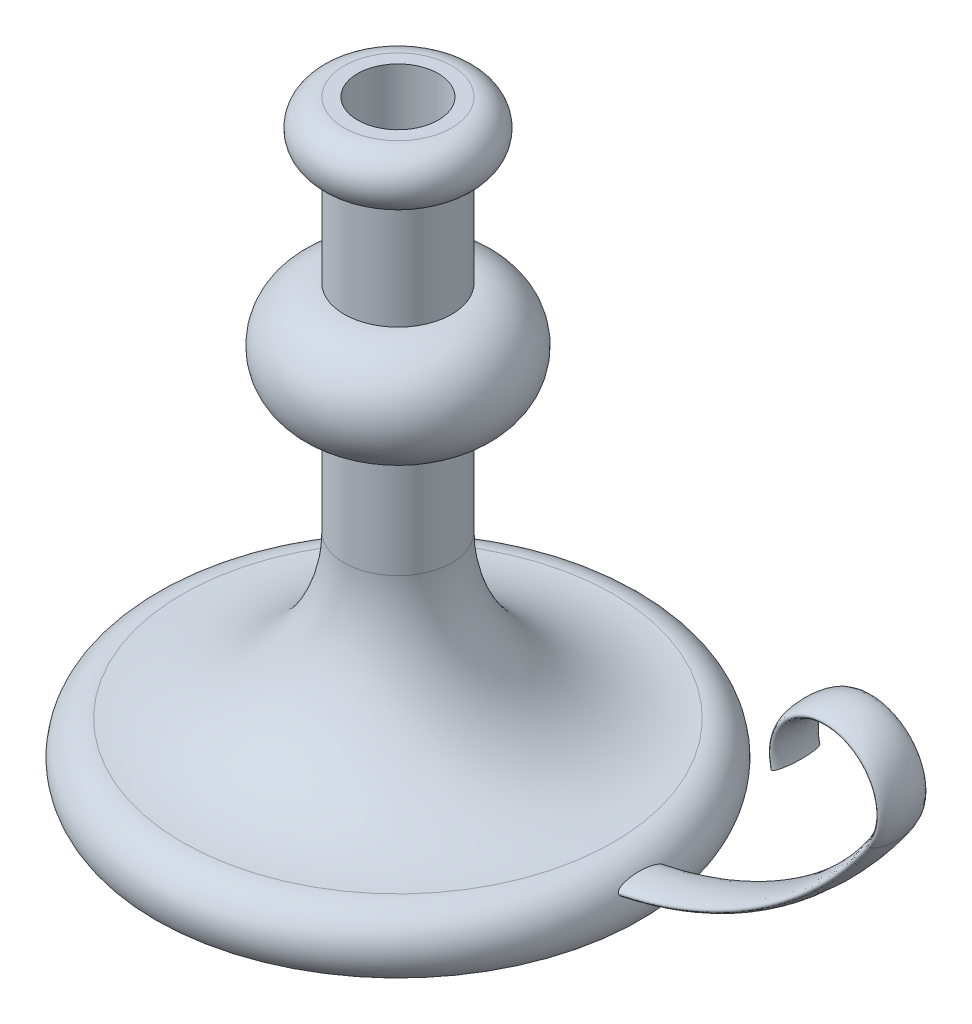
ISO-10303-21;
HEADER;
FILE_DESCRIPTION(('STEP AP214'),'2;1');
FILE_NAME('part.step','',(''),(''),'','','');
FILE_SCHEMA(('AUTOMOTIVE_DESIGN { 1 0 10303 214 1 1 1 1 }'));
ENDSEC;
DATA;
#1=APPLICATION_CONTEXT('core data for automotive mechanical design processes');
#2=APPLICATION_PROTOCOL_DEFINITION('international standard','automotive_design',2000,#1);
#3=PRODUCT_CONTEXT('',#1,'mechanical');
#4=PRODUCT('Part','Part','',(#3));
#5=PRODUCT_RELATED_PRODUCT_CATEGORY('part','',(#4));
#6=PRODUCT_DEFINITION_FORMATION('','',#4);
#7=PRODUCT_DEFINITION_CONTEXT('part definition',#1,'design');
#8=PRODUCT_DEFINITION('design','',#6,#7);
#9=PRODUCT_DEFINITION_SHAPE('','',#8);
#10=(LENGTH_UNIT() NAMED_UNIT(*) SI_UNIT(.MILLI.,.METRE.));
#11=(NAMED_UNIT(*) PLANE_ANGLE_UNIT() SI_UNIT($,.RADIAN.));
#12=(NAMED_UNIT(*) SI_UNIT($,.STERADIAN.) SOLID_ANGLE_UNIT());
#13=UNCERTAINTY_MEASURE_WITH_UNIT(LENGTH_MEASURE(1.E-05),#10,'distance_accuracy_value','');
#14=(GEOMETRIC_REPRESENTATION_CONTEXT(3) GLOBAL_UNCERTAINTY_ASSIGNED_CONTEXT((#13)) GLOBAL_UNIT_ASSIGNED_CONTEXT((#10,
#11,#12)) REPRESENTATION_CONTEXT('',''));
#15=CARTESIAN_POINT('',(0.,0.,0.));
#16=DIRECTION('',(0.,0.,1.));
#17=DIRECTION('',(1.,0.,0.));
#18=AXIS2_PLACEMENT_3D('',#15,#16,#17);
#19=CARTESIAN_POINT('',(0.,190.5,0.));
#20=DIRECTION('',(0.,-1.,0.));
#21=DIRECTION('',(0.,0.,-1.));
#22=AXIS2_PLACEMENT_3D('',#19,#20,#21);
#23=TOROIDAL_SURFACE('',#22,2032.,317.5);
#24=CARTESIAN_POINT('',(2304.1559666721,334.729740597242,-222.25));
#25=CARTESIAN_POINT('',(2303.97400076728,335.084946485986,-222.250000317295));
#26=CARTESIAN_POINT('',(2303.79230153902,335.440285609509,-222.237734709247));
#27=CARTESIAN_POINT('',(2303.4300532062,336.149998636067,-222.188810760381));
#28=CARTESIAN_POINT('',(2303.24950445655,336.504372223619,-222.152145228526));
#29=CARTESIAN_POINT('',(2302.89025183536,337.210751589177,-222.054894841088));
#30=CARTESIAN_POINT('',(2302.71154795634,337.562757376769,-221.994310082416));
#31=CARTESIAN_POINT('',(2302.35634513512,338.26364002046,-221.849914702679));
#32=CARTESIAN_POINT('',(2302.17984913808,338.61251255169,-221.766075930914));
#33=CARTESIAN_POINT('',(2301.8297837212,339.305642684299,-221.576236389163));
#34=CARTESIAN_POINT('',(2301.65621427386,339.649900329024,-221.470235827497));
#35=CARTESIAN_POINT('',(2301.3123953702,340.332949086654,-221.237279933162));
#36=CARTESIAN_POINT('',(2301.14214612569,340.671739850553,-221.110323268416));
#37=CARTESIAN_POINT('',(2300.81313461308,341.32750145886,-220.843160904167));
#38=CARTESIAN_POINT('',(2300.65420662243,341.644753709765,-220.703847524678));
#39=CARTESIAN_POINT('',(2300.33984097271,342.273209002574,-220.408581956684));
#40=CARTESIAN_POINT('',(2300.18440380434,342.584411193221,-220.252627446481));
#41=CARTESIAN_POINT('',(2299.72349975676,343.508495435025,-219.761572973886));
#42=CARTESIAN_POINT('',(2299.42343346316,344.111868858729,-219.403276397344));
#43=CARTESIAN_POINT('',(2298.83772865829,345.292658530768,-218.633669522771));
#44=CARTESIAN_POINT('',(2298.55211848609,345.870023567099,-218.222260313007));
#45=CARTESIAN_POINT('',(2297.99554808247,346.997841011149,-217.355269785157));
#46=CARTESIAN_POINT('',(2297.7245878543,347.548293412915,-216.899688457299));
#47=CARTESIAN_POINT('',(2297.15681673526,348.704272421776,-215.880001450807));
#48=CARTESIAN_POINT('',(2296.86226708659,349.305591120131,-215.309889329515));
#49=CARTESIAN_POINT('',(2296.29012981291,350.476311941716,-214.129220534062));
#50=CARTESIAN_POINT('',(2296.01255337329,351.045692997965,-213.518637730283));
#51=CARTESIAN_POINT('',(2295.47303667554,352.154729955203,-212.26426966855));
#52=CARTESIAN_POINT('',(2295.21110084615,352.694377433642,-211.620475101771));
#53=CARTESIAN_POINT('',(2294.70106197366,353.747214097881,-210.304232540721));
#54=CARTESIAN_POINT('',(2294.45298626695,354.2603508562,-209.631732237341));
#55=CARTESIAN_POINT('',(2293.96999096714,355.261191149071,-208.263986895508));
#56=CARTESIAN_POINT('',(2293.73506639035,355.748904313172,-207.568750633401));
#57=CARTESIAN_POINT('',(2293.27710311745,356.701207702042,-206.158909352676));
#58=CARTESIAN_POINT('',(2293.05406389626,357.16579894826,-205.444305191826));
#59=CARTESIAN_POINT('',(2292.58983838913,358.134230778406,-203.902367277724));
#60=CARTESIAN_POINT('',(2292.3501873304,358.635066312773,-203.0726875968));
#61=CARTESIAN_POINT('',(2291.8834166012,359.612048516542,-201.395429262424));
#62=CARTESIAN_POINT('',(2291.6562978838,360.088193308071,-200.547849254429));
#63=CARTESIAN_POINT('',(2291.21343639336,361.017932700857,-198.837481080693));
#64=CARTESIAN_POINT('',(2290.99769399652,361.471526556355,-197.974692413279));
#65=CARTESIAN_POINT('',(2290.57695752212,362.357242850115,-196.237640079103));
#66=CARTESIAN_POINT('',(2290.37194492899,362.789402203898,-195.363399669401));
#67=CARTESIAN_POINT('',(2289.9713930014,363.634729487632,-193.603741802654));
#68=CARTESIAN_POINT('',(2289.77585297067,364.047898813311,-192.718325173154));
#69=CARTESIAN_POINT('',(2289.39347129017,364.856710589385,-190.937707846759));
#70=CARTESIAN_POINT('',(2289.20662943581,365.252353452009,-190.042507380601));
#71=CARTESIAN_POINT('',(2288.80313401204,366.107586857478,-188.057359230284));
#72=CARTESIAN_POINT('',(2288.58831143304,366.563470009665,-186.965442627711));
#73=CARTESIAN_POINT('',(2288.16931803474,367.453547556042,-184.770747504202));
#74=CARTESIAN_POINT('',(2287.96514769018,367.887740983511,-183.667968501743));
#75=CARTESIAN_POINT('',(2287.56648057395,368.736334786809,-181.452397256692));
#76=CARTESIAN_POINT('',(2287.37198908698,369.150724344853,-180.339599927248));
#77=CARTESIAN_POINT('',(2286.99203640899,369.960925751935,-178.105760766363));
#78=CARTESIAN_POINT('',(2286.80657510066,370.356737842323,-176.984719042249));
#79=CARTESIAN_POINT('',(2286.44385925864,371.131409795074,-174.734386254785));
#80=CARTESIAN_POINT('',(2286.26661187453,371.510254879677,-173.605088959823));
#81=CARTESIAN_POINT('',(2285.91990814355,372.251770040455,-171.340011009868));
#82=CARTESIAN_POINT('',(2285.75045182053,372.614440067101,-170.204230335035));
#83=CARTESIAN_POINT('',(2285.41872363538,373.324807338501,-167.926255360748));
#84=CARTESIAN_POINT('',(2285.25645578989,373.672496209473,-166.784057867621));
#85=CARTESIAN_POINT('',(2284.93874929332,374.353581513749,-164.494457929216));
#86=CARTESIAN_POINT('',(2284.78331073477,374.686977753386,-163.347055413643));
#87=CARTESIAN_POINT('',(2284.32664815517,375.666886621238,-159.898047837324));
#88=CARTESIAN_POINT('',(2284.03504224907,376.293194338468,-157.5894010691));
#89=CARTESIAN_POINT('',(2283.47279425699,377.501546525883,-152.940656207002));
#90=CARTESIAN_POINT('',(2283.20231269835,378.083251540051,-150.600451060843));
#91=CARTESIAN_POINT('',(2282.68251792862,379.20164492048,-145.908690168767));
#92=CARTESIAN_POINT('',(2282.43319050368,379.738363510977,-143.557143184577));
#93=CARTESIAN_POINT('',(2281.95375800258,380.770734080844,-138.844071914548));
#94=CARTESIAN_POINT('',(2281.72364568993,381.266401519678,-136.482551739879));
#95=CARTESIAN_POINT('',(2281.28106671776,382.219896385412,-131.750705134173));
#96=CARTESIAN_POINT('',(2281.06859686085,382.677730668829,-129.380380380519));
#97=CARTESIAN_POINT('',(2280.66001129479,383.55822461802,-124.631965126681));
#98=CARTESIAN_POINT('',(2280.46389464243,383.980886312436,-122.253875082607));
#99=CARTESIAN_POINT('',(2280.0340284667,384.907304769588,-116.822339876186));
#100=CARTESIAN_POINT('',(2279.80516894405,385.400520134522,-113.766707528854));
#101=CARTESIAN_POINT('',(2279.37066167417,386.336815807819,-107.646071965312));
#102=CARTESIAN_POINT('',(2279.16501459503,386.779894673193,-104.581068481995));
#103=CARTESIAN_POINT('',(2278.77536155996,387.619263421602,-98.441873803468));
#104=CARTESIAN_POINT('',(2278.59136552592,388.015531853403,-95.3676790528279));
#105=CARTESIAN_POINT('',(2278.24390369052,388.76367208211,-89.2127758478801));
#106=CARTESIAN_POINT('',(2278.08043771789,389.115544249356,-86.1320674481251));
#107=CARTESIAN_POINT('',(2277.7729162855,389.777327917136,-79.9628219626307));
#108=CARTESIAN_POINT('',(2277.62887564037,390.087207393002,-76.8742807115996));
#109=CARTESIAN_POINT('',(2277.35952720715,390.666504668936,-70.6925931302701));
#110=CARTESIAN_POINT('',(2277.23421945693,390.9359223872,-67.599446790674));
#111=CARTESIAN_POINT('',(2277.00157845047,391.435976365978,-61.4070664060374));
#112=CARTESIAN_POINT('',(2276.8942584433,391.666584041026,-58.3078295600716));
#113=CARTESIAN_POINT('',(2276.69715726784,392.090006106433,-52.106225794538));
#114=CARTESIAN_POINT('',(2276.60737608792,392.282820521872,-49.0038588770487));
#115=CARTESIAN_POINT('',(2276.4448705928,392.631741524039,-42.7949234423548));
#116=CARTESIAN_POINT('',(2276.37215559279,392.787828063796,-39.6883535571163));
#117=CARTESIAN_POINT('',(2276.24350355535,393.063937000793,-33.4732672064837));
#118=CARTESIAN_POINT('',(2276.18756652007,393.183959393437,-30.3647507408417));
#119=CARTESIAN_POINT('',(2276.09220238517,393.388552398515,-24.1454609420847));
#120=CARTESIAN_POINT('',(2276.05277974299,393.473113439479,-21.0346872263773));
#121=CARTESIAN_POINT('',(2275.99029016753,393.607142117669,-14.8122213819607));
#122=CARTESIAN_POINT('',(2275.96722323287,393.656609757837,-11.7005292533285));
#123=CARTESIAN_POINT('',(2275.93735959765,393.720651572324,-5.48004533104016));
#124=CARTESIAN_POINT('',(2275.93054547923,393.735263101327,-2.37125400475369));
#125=CARTESIAN_POINT('',(2275.93310691828,393.729770421141,3.84629144246669));
#126=CARTESIAN_POINT('',(2275.94248247597,393.709666211463,6.95504556340008));
#127=CARTESIAN_POINT('',(2275.97745571493,393.634665642279,13.1705399775705));
#128=CARTESIAN_POINT('',(2276.00304554919,393.579786112528,16.2772805176657));
#129=CARTESIAN_POINT('',(2276.07055255304,393.434990938745,22.489768937834));
#130=CARTESIAN_POINT('',(2276.11246972117,393.345075297852,25.595516817996));
#131=CARTESIAN_POINT('',(2276.21278998992,393.129838651622,31.8037541156748));
#132=CARTESIAN_POINT('',(2276.27118370896,393.00453779426,34.9062443819433));
#133=CARTESIAN_POINT('',(2276.40473334567,392.71789954569,41.1092034517779));
#134=CARTESIAN_POINT('',(2276.47988927004,392.556562140081,44.2096722545356));
#135=CARTESIAN_POINT('',(2276.64726605635,392.197155060524,50.4061265801329));
#136=CARTESIAN_POINT('',(2276.73947649179,391.999107829461,53.5021136836353));
#137=CARTESIAN_POINT('',(2276.94144294481,391.565198280324,59.6908658574333));
#138=CARTESIAN_POINT('',(2277.0511989401,391.329336010303,62.7836309318182));
#139=CARTESIAN_POINT('',(2277.28875339143,390.818676677525,68.9635490001485));
#140=CARTESIAN_POINT('',(2277.41654192283,390.543901031402,72.050704141285));
#141=CARTESIAN_POINT('',(2277.69089771033,389.953783309454,78.2203247330437));
#142=CARTESIAN_POINT('',(2277.8374650633,389.63844102435,81.3027901593893));
#143=CARTESIAN_POINT('',(2278.150177791,388.965430808754,87.4612452943413));
#144=CARTESIAN_POINT('',(2278.31631771633,388.607774659144,90.5372365638493));
#145=CARTESIAN_POINT('',(2278.66923126701,387.847841581022,96.6824756573887));
#146=CARTESIAN_POINT('',(2278.85600452043,387.445565456806,99.7517236019551));
#147=CARTESIAN_POINT('',(2279.24946338851,386.597951443085,105.85162958658));
#148=CARTESIAN_POINT('',(2279.45593144946,386.153083864504,108.882366838902));
#149=CARTESIAN_POINT('',(2279.89181679753,385.213790830797,114.934712427944));
#150=CARTESIAN_POINT('',(2280.1212354629,384.719362399363,117.956320205167));
#151=CARTESIAN_POINT('',(2280.60487085901,383.677063362956,123.988806552023));
#152=CARTESIAN_POINT('',(2280.85909131631,383.129184726858,126.999683438627));
#153=CARTESIAN_POINT('',(2281.39464811048,381.975168752824,133.008979604929));
#154=CARTESIAN_POINT('',(2281.67599359991,381.369011750735,136.007394321141));
#155=CARTESIAN_POINT('',(2282.11978460859,380.413212518826,140.486060671493));
#156=CARTESIAN_POINT('',(2282.27099244288,380.087608277424,141.972587021171));
#157=CARTESIAN_POINT('',(2282.58124293405,379.419687153534,144.941054863001));
#158=CARTESIAN_POINT('',(2282.74028550713,379.077370449832,146.422996404019));
#159=CARTESIAN_POINT('',(2283.06666996238,378.375086596019,149.381717942555));
#160=CARTESIAN_POINT('',(2283.23401152766,378.01512011988,150.858498134861));
#161=CARTESIAN_POINT('',(2283.57753671605,377.276445932768,153.806335435514));
#162=CARTESIAN_POINT('',(2283.75372031754,376.897738267597,155.27739255784));
#163=CARTESIAN_POINT('',(2284.11546421764,376.120526012246,158.212429648398));
#164=CARTESIAN_POINT('',(2284.30102043833,375.722030032952,159.676412395948));
#165=CARTESIAN_POINT('',(2284.68228353137,374.903692727569,162.597100064386));
#166=CARTESIAN_POINT('',(2284.87799050869,374.483851180733,164.053804909839));
#167=CARTESIAN_POINT('',(2285.28028319435,373.621399957182,166.958314947362));
#168=CARTESIAN_POINT('',(2285.4868645248,373.178799444593,168.406123462772));
#169=CARTESIAN_POINT('',(2285.91191056359,372.268846577765,171.292155891668));
#170=CARTESIAN_POINT('',(2286.13037484511,371.801495112541,172.730380147319));
#171=CARTESIAN_POINT('',(2286.50501457793,371.000775681001,175.116324286067));
#172=CARTESIAN_POINT('',(2286.65757076113,370.674905441508,176.067133534953));
#173=CARTESIAN_POINT('',(2286.96880891227,370.010523829288,177.963313973002));
#174=CARTESIAN_POINT('',(2287.12749081295,369.67201259535,178.908685221737));
#175=CARTESIAN_POINT('',(2287.45139818166,368.981540942848,180.793390187422));
#176=CARTESIAN_POINT('',(2287.6166237008,368.629580419265,181.73272385716));
#177=CARTESIAN_POINT('',(2287.95439970257,367.910642348534,183.606371500972));
#178=CARTESIAN_POINT('',(2288.12696324613,367.543638070813,184.540672878412));
#179=CARTESIAN_POINT('',(2288.47965952226,366.794207225628,186.401646269481));
#180=CARTESIAN_POINT('',(2288.65979228484,366.411780597011,187.328318252841));
#181=CARTESIAN_POINT('',(2289.02822982768,365.630354881972,189.173022885806));
#182=CARTESIAN_POINT('',(2289.21653465179,365.231355706609,190.091055489013));
#183=CARTESIAN_POINT('',(2289.6448478025,364.324795037924,192.120291348987));
#184=CARTESIAN_POINT('',(2289.8870442259,363.812817766327,193.229069236913));
#185=CARTESIAN_POINT('',(2290.38613746172,362.759382337593,195.429329529611));
#186=CARTESIAN_POINT('',(2290.64303537408,362.217921974719,196.520810632441));
#187=CARTESIAN_POINT('',(2291.1733321821,361.102125334291,198.683324808603));
#188=CARTESIAN_POINT('',(2291.44673688944,360.527777481476,199.754350503261));
#189=CARTESIAN_POINT('',(2292.01145365966,359.343740251149,201.869001725569));
#190=CARTESIAN_POINT('',(2292.30272795575,358.734125554651,202.912678810961));
#191=CARTESIAN_POINT('',(2292.75521538111,357.789156034455,204.45468975405));
#192=CARTESIAN_POINT('',(2292.90862632864,357.469104468827,204.964732086247));
#193=CARTESIAN_POINT('',(2293.22100529682,356.818148280874,205.97610337213));
#194=CARTESIAN_POINT('',(2293.37997308209,356.487244118297,206.477432693552));
#195=CARTESIAN_POINT('',(2293.70375748671,355.814074595704,207.470071690455));
#196=CARTESIAN_POINT('',(2293.86857087751,355.471815513591,207.961386667846));
#197=CARTESIAN_POINT('',(2294.20452835707,354.775046945159,208.933014798618));
#198=CARTESIAN_POINT('',(2294.3756721977,354.420537939022,209.413328382016));
#199=CARTESIAN_POINT('',(2294.79668411037,353.549641219511,210.556994354342));
#200=CARTESIAN_POINT('',(2295.04992672585,353.026754487979,211.214196968444));
#201=CARTESIAN_POINT('',(2295.57127045709,351.952589661247,212.498969975302));
#202=CARTESIAN_POINT('',(2295.83937182725,351.401311079925,213.126539860335));
#203=CARTESIAN_POINT('',(2296.39189106745,350.267848588138,214.34590821425));
#204=CARTESIAN_POINT('',(2296.67631114083,349.685660505078,214.937701830372));
#205=CARTESIAN_POINT('',(2297.26282605357,348.488168820093,216.077536841372));
#206=CARTESIAN_POINT('',(2297.5649181129,347.872870428056,216.625585086053));
#207=CARTESIAN_POINT('',(2298.13553440219,346.713893172404,217.580359449584));
#208=CARTESIAN_POINT('',(2298.40114558342,346.175600518545,217.995343005445));
#209=CARTESIAN_POINT('',(2298.94594089987,345.074260807971,218.781573978856));
#210=CARTESIAN_POINT('',(2299.22512533524,344.511213203884,219.152820428639));
#211=CARTESIAN_POINT('',(2299.7966150989,343.361741711216,219.843235882668));
#212=CARTESIAN_POINT('',(2300.08889722847,342.77535934476,220.162492657514));
#213=CARTESIAN_POINT('',(2300.68639283373,341.580076205633,220.741249997513));
#214=CARTESIAN_POINT('',(2300.99160218381,340.971182625,221.000769459715));
#215=CARTESIAN_POINT('',(2301.5447135309,339.871063896606,221.401907713103));
#216=CARTESIAN_POINT('',(2301.79037180685,339.383576736963,221.556907441218));
#217=CARTESIAN_POINT('',(2302.28751535715,338.399449788857,221.822118517773));
#218=CARTESIAN_POINT('',(2302.53899989802,337.902811154077,221.932335471921));
#219=CARTESIAN_POINT('',(2303.04614851452,336.903807265541,222.105154374164));
#220=CARTESIAN_POINT('',(2303.3018096622,336.401446092449,222.167788329899));
#221=CARTESIAN_POINT('',(2303.81570138599,335.394282758894,222.243911547522));
#222=CARTESIAN_POINT('',(2304.0739320109,334.889480552161,222.257399874152));
#223=CARTESIAN_POINT('',(2304.59116809822,333.881012829238,222.234916971281));
#224=CARTESIAN_POINT('',(2304.85017392609,333.377348152779,222.198916745714));
#225=CARTESIAN_POINT('',(2305.36687811629,332.375214776092,222.078504889112));
#226=CARTESIAN_POINT('',(2305.62457649501,331.876746010611,221.994093866792));
#227=CARTESIAN_POINT('',(2306.13710927714,330.887962633609,221.779111932763));
#228=CARTESIAN_POINT('',(2306.39194154834,330.397653977429,221.648508733927));
#229=CARTESIAN_POINT('',(2306.89712957165,329.428192071975,221.344406458596));
#230=CARTESIAN_POINT('',(2307.14748472163,328.949040320587,221.170901658198));
#231=CARTESIAN_POINT('',(2307.73051507625,327.836065538908,220.716201464492));
#232=CARTESIAN_POINT('',(2308.06087584194,327.207694129342,220.41863975268));
#233=CARTESIAN_POINT('',(2308.70966572514,325.977826055669,219.761524789015));
#234=CARTESIAN_POINT('',(2309.02809030519,325.376339595315,219.4019482478));
#235=CARTESIAN_POINT('',(2309.6528603122,324.200051842096,218.629494370956));
#236=CARTESIAN_POINT('',(2309.9591788037,323.625309599838,218.216506052761));
#237=CARTESIAN_POINT('',(2310.55894292796,322.503544755947,217.346265533012));
#238=CARTESIAN_POINT('',(2310.85238876539,321.956521713559,216.88901403561));
#239=CARTESIAN_POINT('',(2311.47369678749,320.80185371454,215.859685735381));
#240=CARTESIAN_POINT('',(2311.79935718106,320.198890247036,215.281049578088));
#241=CARTESIAN_POINT('',(2312.43493094797,319.026099440702,214.082404685798));
#242=CARTESIAN_POINT('',(2312.74483365858,318.456294502512,213.462368576131));
#243=CARTESIAN_POINT('',(2313.34989865447,317.347390508939,212.188358628695));
#244=CARTESIAN_POINT('',(2313.64505666264,316.808300356939,211.534375054412));
#245=CARTESIAN_POINT('',(2314.22224481041,315.757368261468,210.197130710167));
#246=CARTESIAN_POINT('',(2314.50424864128,315.245580653028,209.513816110381));
#247=CARTESIAN_POINT('',(2315.05552631118,314.248089259701,208.123949700319));
#248=CARTESIAN_POINT('',(2315.32480505968,313.762375405287,207.417407033054));
#249=CARTESIAN_POINT('',(2315.85175626195,312.814599894487,205.984524171191));
#250=CARTESIAN_POINT('',(2316.10942924997,312.352537149186,205.258184890407));
#251=CARTESIAN_POINT('',(2316.64818521822,311.389085485827,203.689384579682));
#252=CARTESIAN_POINT('',(2316.92773121574,310.890810925477,202.844486798383));
#253=CARTESIAN_POINT('',(2317.47429829023,309.919483205357,201.136307053958));
#254=CARTESIAN_POINT('',(2317.74131837984,309.446432033442,200.273023649344));
#255=CARTESIAN_POINT('',(2318.26387073472,308.523320088651,198.53082445298));
#256=CARTESIAN_POINT('',(2318.51940261741,308.073260081358,197.651908141982));
#257=CARTESIAN_POINT('',(2319.01942523523,307.194995746726,195.882303436447));
#258=CARTESIAN_POINT('',(2319.26393546256,306.766752645432,194.991639740054));
#259=CARTESIAN_POINT('',(2319.74319766635,305.929560163314,193.198799293259));
#260=CARTESIAN_POINT('',(2319.97795035951,305.520609365159,192.296623394818));
#261=CARTESIAN_POINT('',(2320.43841179741,304.720487966243,190.482179384812));
#262=CARTESIAN_POINT('',(2320.66412073421,304.329316987848,189.569911488106));
#263=CARTESIAN_POINT('',(2321.15298097529,303.484143616711,187.546677093603));
#264=CARTESIAN_POINT('',(2321.41420941684,303.033900000228,186.433676242449));
#265=CARTESIAN_POINT('',(2321.92535974959,302.155361528522,184.196438992824));
#266=CARTESIAN_POINT('',(2322.17528113643,301.727067652266,183.072202095889));
#267=CARTESIAN_POINT('',(2322.66475906761,300.890487289843,180.813356521097));
#268=CARTESIAN_POINT('',(2322.90430987934,300.48221185326,179.678742516354));
#269=CARTESIAN_POINT('',(2323.37361293817,299.684414519587,177.400957334864));
#270=CARTESIAN_POINT('',(2323.60336531256,299.294892378846,176.257786269518));
#271=CARTESIAN_POINT('',(2324.05389266912,298.5329500473,173.962886342094));
#272=CARTESIAN_POINT('',(2324.27465980593,298.160544766677,172.811150997574));
#273=CARTESIAN_POINT('',(2324.70755997929,297.432027698844,170.500928778975));
#274=CARTESIAN_POINT('',(2324.91969298935,297.075915961612,169.342441884201));
#275=CARTESIAN_POINT('',(2325.33592654932,296.378765970446,167.018794839453));
#276=CARTESIAN_POINT('',(2325.54002261841,296.037736112396,165.853631370419));
#277=CARTESIAN_POINT('',(2325.94049113434,295.370046649272,163.517866440232));
#278=CARTESIAN_POINT('',(2326.13686347513,295.043387241533,162.347264904646));
#279=CARTESIAN_POINT('',(2326.71494700723,294.083782075721,158.828346540062));
#280=CARTESIAN_POINT('',(2327.08567028129,293.471133122043,156.472660305166));
#281=CARTESIAN_POINT('',(2327.80304400369,292.290127590461,151.727898694317));
#282=CARTESIAN_POINT('',(2328.14949787996,291.722128953177,149.338705152247));
#283=CARTESIAN_POINT('',(2328.81726270784,290.631239012606,144.548308158187));
#284=CARTESIAN_POINT('',(2329.13859054616,290.108317389318,142.147113946614));
#285=CARTESIAN_POINT('',(2329.75802723384,289.103571552426,137.334139671382));
#286=CARTESIAN_POINT('',(2330.05614469428,288.621732090921,134.922363887682));
#287=CARTESIAN_POINT('',(2330.63072210752,287.695879644081,130.089443421394));
#288=CARTESIAN_POINT('',(2330.90718574789,287.251860216984,127.668300408033));
#289=CARTESIAN_POINT('',(2331.43973724075,286.39894846951,122.817727789035));
#290=CARTESIAN_POINT('',(2331.6958259481,285.990054675303,120.388298535531));
#291=CARTESIAN_POINT('',(2332.24337299293,285.118055630006,114.982317639592));
#292=CARTESIAN_POINT('',(2332.53007128155,284.663052777181,112.003975966098));
#293=CARTESIAN_POINT('',(2333.07624055539,283.798708181418,106.038133611618));
#294=CARTESIAN_POINT('',(2333.33571081506,283.389367655223,103.050632688748));
#295=CARTESIAN_POINT('',(2333.82884420896,282.613375177224,97.0665860224905));
#296=CARTESIAN_POINT('',(2334.06249551809,282.246742781637,94.0700367751233));
#297=CARTESIAN_POINT('',(2334.50494821728,281.554043203521,88.0704593450937));
#298=CARTESIAN_POINT('',(2334.71374979768,281.227975710291,85.0674312122347));
#299=CARTESIAN_POINT('',(2335.1075580208,280.614229565091,79.0537078222784));
#300=CARTESIAN_POINT('',(2335.29254738193,280.32657878822,76.0430085959441));
#301=CARTESIAN_POINT('',(2335.63931385452,279.788313507089,70.016968838044));
#302=CARTESIAN_POINT('',(2335.80109092248,279.537699072252,67.001628297789));
#303=CARTESIAN_POINT('',(2336.10216433549,279.071995871223,60.9649988945571));
#304=CARTESIAN_POINT('',(2336.24144514088,278.856931659564,57.9437073667161));
#305=CARTESIAN_POINT('',(2336.49790827683,278.46142523202,51.8979290393351));
#306=CARTESIAN_POINT('',(2336.61509062086,278.280982995039,48.8734422417432));
#307=CARTESIAN_POINT('',(2336.82782816995,277.953737303507,42.8203724946982));
#308=CARTESIAN_POINT('',(2336.9233725159,277.806950738704,39.7917882524925));
#309=CARTESIAN_POINT('',(2337.09308928319,277.546419458938,33.7326031001546));
#310=CARTESIAN_POINT('',(2337.16726170174,277.432674748296,30.7020021897587));
#311=CARTESIAN_POINT('',(2337.29449906758,277.23766512759,24.6386128000735));
#312=CARTESIAN_POINT('',(2337.34755912837,277.156407736764,21.6058239769217));
#313=CARTESIAN_POINT('',(2337.43272261911,277.026031342485,15.5392632032978));
#314=CARTESIAN_POINT('',(2337.46482605166,276.97691233506,12.5054912529471));
#315=CARTESIAN_POINT('',(2337.5081015309,276.910707836945,6.44857128958281));
#316=CARTESIAN_POINT('',(2337.51934986722,276.893505591999,3.42542509425173));
#317=CARTESIAN_POINT('',(2337.5211833515,276.890701332627,-2.6208881947705));
#318=CARTESIAN_POINT('',(2337.51176849994,276.905099317457,-5.64405528846115));
#319=CARTESIAN_POINT('',(2337.47225438934,276.965547154239,-11.6885529693951));
#320=CARTESIAN_POINT('',(2337.44216461015,277.011582499854,-14.7098837634074));
#321=CARTESIAN_POINT('',(2337.36121328901,277.135500245709,-20.7516149549754));
#322=CARTESIAN_POINT('',(2337.31035174886,277.213382643186,-23.7720153526118));
#323=CARTESIAN_POINT('',(2337.18772288325,277.401304616209,-29.8097948696863));
#324=CARTESIAN_POINT('',(2337.11596661896,277.511327177616,-32.8271747422493));
#325=CARTESIAN_POINT('',(2336.95129901713,277.764061425008,-38.8599917887159));
#326=CARTESIAN_POINT('',(2336.85838767092,277.906773124395,-41.8754289618224));
#327=CARTESIAN_POINT('',(2336.65115074173,278.225481133382,-47.9021138111126));
#328=CARTESIAN_POINT('',(2336.53683719477,278.401458735682,-50.9133628883346));
#329=CARTESIAN_POINT('',(2336.28635944221,278.787618227246,-56.9327583649841));
#330=CARTESIAN_POINT('',(2336.15019526667,278.997800069474,-59.9409047686726));
#331=CARTESIAN_POINT('',(2335.85559191534,279.453326862258,-65.9519208749671));
#332=CARTESIAN_POINT('',(2335.69716399233,279.698654050502,-68.95479247207));
#333=CARTESIAN_POINT('',(2335.357373972,280.225856492306,-74.9560514150153));
#334=CARTESIAN_POINT('',(2335.17601174953,280.507731945304,-77.9544387362973));
#335=CARTESIAN_POINT('',(2334.78967184139,281.109524008,-83.9450800523808));
#336=CARTESIAN_POINT('',(2334.58470036242,281.429430620297,-86.9373354496384));
#337=CARTESIAN_POINT('',(2334.15022827128,282.109222260688,-92.9154778811653));
#338=CARTESIAN_POINT('',(2333.92072813572,282.469106512012,-95.9013650380218));
#339=CARTESIAN_POINT('',(2333.48259659564,283.158066434037,-101.293837626042));
#340=CARTESIAN_POINT('',(2333.27840163477,283.479817806583,-103.701721005148));
#341=CARTESIAN_POINT('',(2332.85262867964,284.15233960528,-108.511922706681));
#342=CARTESIAN_POINT('',(2332.63105055353,284.503110251538,-110.914240986756));
#343=CARTESIAN_POINT('',(2332.16974040221,285.235312479242,-115.712515607379));
#344=CARTESIAN_POINT('',(2331.93000798892,285.616744716146,-118.108471810794));
#345=CARTESIAN_POINT('',(2331.43151350569,286.412146491187,-122.892819508234));
#346=CARTESIAN_POINT('',(2331.17275286815,286.826113580323,-125.281211557586));
#347=CARTESIAN_POINT('',(2330.63513343871,287.688848877491,-130.049418421201));
#348=CARTESIAN_POINT('',(2330.35627486806,288.137616702415,-132.429233329585));
#349=CARTESIAN_POINT('',(2329.77721934291,289.072588345898,-137.1788321874));
#350=CARTESIAN_POINT('',(2329.47702319374,289.558790751633,-139.54861651184));
#351=CARTESIAN_POINT('',(2328.94584033243,290.422190091537,-143.57818748196));
#352=CARTESIAN_POINT('',(2328.72060299555,290.789163328168,-145.240927657748));
#353=CARTESIAN_POINT('',(2328.25817434764,291.544573954349,-148.559860194451));
#354=CARTESIAN_POINT('',(2328.02098310446,291.933011222073,-150.216052592474));
#355=CARTESIAN_POINT('',(2327.53394141518,292.732837421793,-153.521080394654));
#356=CARTESIAN_POINT('',(2327.28409058752,293.14422704562,-155.16991557543));
#357=CARTESIAN_POINT('',(2326.77128356698,293.991066543632,-158.456889139495));
#358=CARTESIAN_POINT('',(2326.50834588146,294.426482529606,-160.095039120296));
#359=CARTESIAN_POINT('',(2325.9681254588,295.323843347894,-163.36165263025));
#360=CARTESIAN_POINT('',(2325.69084302624,295.785787616984,-164.990116364244));
#361=CARTESIAN_POINT('',(2325.12086006076,296.738474701456,-168.235796448381));
#362=CARTESIAN_POINT('',(2324.82816062172,297.229215473939,-169.853013587307));
#363=CARTESIAN_POINT('',(2324.37680950271,297.988580034867,-172.267806299789));
#364=CARTESIAN_POINT('',(2324.22442959831,298.245372598328,-173.070291023292));
#365=CARTESIAN_POINT('',(2323.91532055853,298.767203244711,-174.67172736313));
#366=CARTESIAN_POINT('',(2323.75859148192,299.032241216244,-175.470679027028));
#367=CARTESIAN_POINT('',(2323.44058522819,299.570981677819,-177.064752915523));
#368=CARTESIAN_POINT('',(2323.27930802872,299.844684210441,-177.859875121279));
#369=CARTESIAN_POINT('',(2322.9514547563,300.402119498472,-179.448529128278));
#370=CARTESIAN_POINT('',(2322.78486309526,300.685882097481,-180.242047250256));
#371=CARTESIAN_POINT('',(2322.44664465345,301.263094623119,-181.824476821881));
#372=CARTESIAN_POINT('',(2322.27501788301,301.556544529882,-182.613388280972));
#373=CARTESIAN_POINT('',(2321.92646839819,302.153684687393,-184.186130153359));
#374=CARTESIAN_POINT('',(2321.74954578382,302.457374744769,-184.969960662269));
#375=CARTESIAN_POINT('',(2321.2966853879,303.236309472805,-186.938072825325));
#376=CARTESIAN_POINT('',(2321.01708488879,303.718669717271,-188.118713072451));
#377=CARTESIAN_POINT('',(2320.44378957336,304.710971249434,-190.465042242399));
#378=CARTESIAN_POINT('',(2320.150093485,305.220915026916,-191.630729803751));
#379=CARTESIAN_POINT('',(2319.54713496996,306.271468699665,-193.944795116378));
#380=CARTESIAN_POINT('',(2319.2378661398,306.812091221769,-195.093165490437));
#381=CARTESIAN_POINT('',(2318.60192948048,307.927826253108,-197.369777389791));
#382=CARTESIAN_POINT('',(2318.27524364416,308.502974538453,-198.497996407139));
#383=CARTESIAN_POINT('',(2317.60472521502,309.688036452392,-200.722305058464));
#384=CARTESIAN_POINT('',(2317.26099919144,310.297736759202,-201.818539519207));
#385=CARTESIAN_POINT('',(2316.72967057434,311.244058704926,-203.439020495069));
#386=CARTESIAN_POINT('',(2316.54994657106,311.564778812071,-203.975177778056));
#387=CARTESIAN_POINT('',(2316.18491911996,312.217525654925,-205.038625580235));
#388=CARTESIAN_POINT('',(2315.99961590788,312.549551912959,-205.565916472622));
#389=CARTESIAN_POINT('',(2315.62333520664,313.22521077179,-206.609874166655));
#390=CARTESIAN_POINT('',(2315.43236561652,313.56882729927,-207.126554202198));
#391=CARTESIAN_POINT('',(2315.04414246852,314.268902776989,-208.148767643713));
#392=CARTESIAN_POINT('',(2314.84688878201,314.625361990126,-208.654300821161));
#393=CARTESIAN_POINT('',(2314.44593830049,315.351567057425,-209.652155018192));
#394=CARTESIAN_POINT('',(2314.24224925545,315.721296997878,-210.144490702017));
#395=CARTESIAN_POINT('',(2313.82781207661,316.475329555714,-211.114777092405));
#396=CARTESIAN_POINT('',(2313.61706444131,316.859631144271,-211.592728810282));
#397=CARTESIAN_POINT('',(2313.13586561419,317.739223163394,-212.646554653563));
#398=CARTESIAN_POINT('',(2312.86336262364,318.238770452006,-213.21796447885));
#399=CARTESIAN_POINT('',(2312.30589378807,319.263921655878,-214.330726733067));
#400=CARTESIAN_POINT('',(2312.02092718531,319.789527155653,-214.872077329941));
#401=CARTESIAN_POINT('',(2311.43770606932,320.868766721057,-215.918880684808));
#402=CARTESIAN_POINT('',(2311.13944917658,321.422405808319,-216.42432697205));
#403=CARTESIAN_POINT('',(2310.52910537572,322.559215097107,-217.391919496566));
#404=CARTESIAN_POINT('',(2310.2170205621,323.142380828159,-217.854072258662));
#405=CARTESIAN_POINT('',(2309.62520235993,324.25217157039,-218.66287476395));
#406=CARTESIAN_POINT('',(2309.34736951564,324.774676015003,-219.016546059044));
#407=CARTESIAN_POINT('',(2308.78158062934,325.842021557688,-219.679619455987));
#408=CARTESIAN_POINT('',(2308.4936240681,326.386863801643,-219.98901928314));
#409=CARTESIAN_POINT('',(2307.90886996439,327.496794657369,-220.555989353939));
#410=CARTESIAN_POINT('',(2307.61209351264,328.061835537146,-220.813673356679));
#411=CARTESIAN_POINT('',(2307.16103567258,328.923388258558,-221.156532489482));
#412=CARTESIAN_POINT('',(2307.00971192654,329.212883141226,-221.263534948171));
#413=CARTESIAN_POINT('',(2306.70530774774,329.796170233056,-221.462184318241));
#414=CARTESIAN_POINT('',(2306.55222750714,330.089961973077,-221.553832892581));
#415=CARTESIAN_POINT('',(2306.21416288371,330.739824448941,-221.737515391385));
#416=CARTESIAN_POINT('',(2306.02885423559,331.096724810584,-221.826043390914));
#417=CARTESIAN_POINT('',(2305.65666596777,331.814942429055,-221.978763744768));
#418=CARTESIAN_POINT('',(2305.4697862009,332.176260101175,-222.042953792524));
#419=CARTESIAN_POINT('',(2305.09510622659,332.902077215723,-222.146069249722));
#420=CARTESIAN_POINT('',(2304.90730591753,333.26657701312,-222.184991803092));
#421=CARTESIAN_POINT('',(2304.53156472971,333.997251099378,-222.236954142983));
#422=CARTESIAN_POINT('',(2304.34362389139,334.363424998593,-222.249999672781));
#423=CARTESIAN_POINT('',(2304.1559666721,334.729740597242,-222.25));
#424=B_SPLINE_CURVE_WITH_KNOTS('',3,(#24,#25,#26,#27,#28,#29,#30,#31,#32,#33,#34,#35,#36,#37,
#38,#39,#40,#41,#42,#43,#44,#45,#46,#47,#48,#49,#50,#51,#52,#53,#54,#55,#56,#57,#58,#59,#60,#61,
#62,#63,#64,#65,#66,#67,#68,#69,#70,#71,#72,#73,#74,#75,#76,#77,#78,#79,#80,#81,#82,#83,#84,#85,
#86,#87,#88,#89,#90,#91,#92,#93,#94,#95,#96,#97,#98,#99,#100,#101,#102,#103,#104,#105,#106,#107,
#108,#109,#110,#111,#112,#113,#114,#115,#116,#117,#118,#119,#120,#121,#122,#123,#124,#125,#126,
#127,#128,#129,#130,#131,#132,#133,#134,#135,#136,#137,#138,#139,#140,#141,#142,#143,#144,#145,
#146,#147,#148,#149,#150,#151,#152,#153,#154,#155,#156,#157,#158,#159,#160,#161,#162,#163,#164,
#165,#166,#167,#168,#169,#170,#171,#172,#173,#174,#175,#176,#177,#178,#179,#180,#181,#182,#183,
#184,#185,#186,#187,#188,#189,#190,#191,#192,#193,#194,#195,#196,#197,#198,#199,#200,#201,#202,
#203,#204,#205,#206,#207,#208,#209,#210,#211,#212,#213,#214,#215,#216,#217,#218,#219,#220,#221,
#222,#223,#224,#225,#226,#227,#228,#229,#230,#231,#232,#233,#234,#235,#236,#237,#238,#239,#240,
#241,#242,#243,#244,#245,#246,#247,#248,#249,#250,#251,#252,#253,#254,#255,#256,#257,#258,#259,
#260,#261,#262,#263,#264,#265,#266,#267,#268,#269,#270,#271,#272,#273,#274,#275,#276,#277,#278,
#279,#280,#281,#282,#283,#284,#285,#286,#287,#288,#289,#290,#291,#292,#293,#294,#295,#296,#297,
#298,#299,#300,#301,#302,#303,#304,#305,#306,#307,#308,#309,#310,#311,#312,#313,#314,#315,#316,
#317,#318,#319,#320,#321,#322,#323,#324,#325,#326,#327,#328,#329,#330,#331,#332,#333,#334,#335,
#336,#337,#338,#339,#340,#341,#342,#343,#344,#345,#346,#347,#348,#349,#350,#351,#352,#353,#354,
#355,#356,#357,#358,#359,#360,#361,#362,#363,#364,#365,#366,#367,#368,#369,#370,#371,#372,#373,
#374,#375,#376,#377,#378,#379,#380,#381,#382,#383,#384,#385,#386,#387,#388,#389,#390,#391,#392,
#393,#394,#395,#396,#397,#398,#399,#400,#401,#402,#403,#404,#405,#406,#407,#408,#409,#410,#411,
#412,#413,#414,#415,#416,#417,#418,#419,#420,#421,#422,#423),.UNSPECIFIED.,.T.,.F.,(4,2,2,2,2,2,
2,2,2,2,2,2,2,2,2,2,2,2,2,2,2,2,2,2,2,2,2,2,2,2,2,2,2,2,2,2,2,2,2,2,2,2,2,2,2,2,2,2,2,2,2,2,2,2,
2,2,2,2,2,2,2,2,2,2,2,2,2,2,2,2,2,2,2,2,2,2,2,2,2,2,2,2,2,2,2,2,2,2,2,2,2,2,2,2,2,2,2,2,2,2,2,2,
2,2,2,2,2,2,2,2,2,2,2,2,2,2,2,2,2,2,2,2,2,2,2,2,2,2,2,2,2,2,2,2,2,2,2,2,2,2,2,2,2,2,2,2,2,2,2,2,
2,2,2,2,2,2,2,2,2,2,2,2,2,2,2,2,2,2,2,2,2,2,2,2,2,2,2,2,2,2,2,2,2,2,2,2,2,2,2,2,2,2,2,2,2,2,2,2,
2,4),(0.,1.19711481408708,2.39458259283852,3.59204551993814,4.79096443926918,5.98987208933907,
7.18885597743909,8.33200446228906,9.47531264321811,11.761880156176,14.0527690900997,
16.3436585308144,18.9799203112018,21.6179010754799,24.2566252917412,26.9003823886452,
29.5431307383899,32.1857622365137,35.1800847581801,38.1746346821461,41.1692835700432,
44.1585818362365,47.1476600425051,50.1366679071079,53.7441506387034,57.3517940140747,
60.9613860379391,64.5709311548783,68.1835612568104,71.7962024200198,75.4108373615913,
79.0255212665791,86.2541230117462,93.5331782954422,100.807303259646,108.078676283759,
115.348728610637,122.618361333008,131.928683105741,141.239272772483,150.554112669762,
159.868874860524,169.190701216169,178.512546418161,187.841227840599,197.169903072297,
206.503658371792,215.837414860398,225.173689029466,234.50996241549,243.836225776982,
253.162489269744,262.484242696746,271.80599528915,281.122450837489,290.438910109238,
299.74969235378,309.060462767171,318.366128612449,327.671842466386,336.974971525432,
346.277932918323,355.487961970194,364.698544449434,373.91051299631,383.125600806547,
387.713290644234,392.300931414901,396.888397139006,401.475851651977,406.061327134108,
410.646850047226,415.230540795896,419.814067017386,422.863810440231,425.913520388913,
428.963254156427,432.018664111801,435.074086183806,438.12952465567,441.864194514928,
445.599144162982,449.335416562566,453.064047724156,454.928035136501,456.791943686608,
458.654838352292,460.517660077415,463.148239331818,465.778863641765,468.409843977483,
471.040411533687,473.228031048966,475.415698960337,477.599634410231,479.782878050904,
481.483570936522,483.184050871348,484.883385929538,486.582753326488,488.283116832077,
489.983458957842,491.684991934914,493.386752051995,495.692406011897,497.998927741713,
500.310321522276,502.621678538509,505.310355670631,508.000828573568,510.692077444609,
513.388496374471,516.083866359241,518.779112135348,521.83828856415,524.897705731297,
527.957224707648,531.011101562117,534.064753709666,537.118340969119,540.804131496218,
544.490086268291,548.178053187937,551.865972178961,555.557045018215,559.248129178352,
562.941242896072,566.634407311499,574.019924480052,581.459627470088,588.894286622175,
596.326174231788,603.756793450302,611.187100736107,620.266085160134,629.345311449713,
638.42867894388,647.511976861121,656.601830203764,665.691700584625,674.787823337834,
683.883940548313,692.984612607673,702.085285857044,711.188064253397,720.290841525122,
729.360253900659,738.429666062661,747.494922497174,756.560178144686,765.62064355885,
774.68111268809,783.736501679326,792.79187821801,801.84269424714,810.893559667413,
819.942051090284,828.990366730513,836.30370187366,843.617092492433,850.930639492252,
858.243636504298,865.556553021611,872.869193676332,878.021789911617,883.174356904549,
888.327079290227,893.47271104079,898.618233584063,903.763391530398,906.332058534145,
908.900690852125,911.469335795007,914.046371306751,916.623401534009,919.200383124928,
923.116949065487,927.033869120703,930.952413172524,934.875090219062,938.775743244182,
940.725886814739,942.67594809535,944.623408057138,946.570907907301,948.516145683511,
950.461246371812,952.879539818029,955.297980493566,957.716855925612,960.135366217324,
962.201951696904,964.268643320892,966.330737785181,967.361637197902,968.392424882963,
969.626999222875,970.861690537297,972.096521388777,973.331078144927),.UNSPECIFIED.);
#425=CARTESIAN_POINT('',(2304.1559666721,334.729740597242,-222.25));
#426=VERTEX_POINT('',#425);
#427=EDGE_CURVE('E11',#426,#426,#424,.T.);
#428=ORIENTED_EDGE('',*,*,#427,.F.);
#429=EDGE_LOOP('',(#428));
#430=FACE_BOUND('',#429,.T.);
#431=CARTESIAN_POINT('',(0.,508.,0.));
#432=DIRECTION('',(0.,-1.,0.));
#433=DIRECTION('',(0.,0.,-1.));
#434=AXIS2_PLACEMENT_3D('',#431,#432,#433);
#435=CIRCLE('',#434,2032.);
#436=CARTESIAN_POINT('',(0.,508.,-2032.));
#437=VERTEX_POINT('',#436);
#438=EDGE_CURVE('E59',#437,#437,#435,.T.);
#439=ORIENTED_EDGE('',*,*,#438,.T.);
#440=EDGE_LOOP('',(#439));
#441=FACE_BOUND('',#440,.T.);
#442=CARTESIAN_POINT('',(0.,0.,0.));
#443=DIRECTION('',(0.,-1.,0.));
#444=DIRECTION('',(0.,0.,-1.));
#445=AXIS2_PLACEMENT_3D('',#442,#443,#444);
#446=CIRCLE('',#445,2286.);
#447=CARTESIAN_POINT('',(0.,0.,-2286.));
#448=VERTEX_POINT('',#447);
#449=EDGE_CURVE('E51',#448,#448,#446,.T.);
#450=ORIENTED_EDGE('',*,*,#449,.F.);
#451=EDGE_LOOP('',(#450));
#452=FACE_BOUND('',#451,.T.);
#453=ADVANCED_FACE('F39',(#430,#441,#452),#23,.T.);
#454=CARTESIAN_POINT('',(2286.,0.,0.));
#455=DIRECTION('',(0.,-1.,0.));
#456=DIRECTION('',(0.,0.,-1.));
#457=AXIS2_PLACEMENT_3D('',#454,#455,#456);
#458=PLANE('',#457);
#459=ORIENTED_EDGE('',*,*,#449,.T.);
#460=EDGE_LOOP('',(#459));
#461=FACE_BOUND('',#460,.T.);
#462=ADVANCED_FACE('F94',(#461),#458,.T.);
#463=CARTESIAN_POINT('',(0.,5588.,0.));
#464=DIRECTION('',(0.,1.,0.));
#465=DIRECTION('',(0.,0.,1.));
#466=AXIS2_PLACEMENT_3D('',#463,#464,#465);
#467=PLANE('',#466);
#468=CARTESIAN_POINT('',(0.,5588.,0.));
#469=DIRECTION('',(0.,1.,0.));
#470=DIRECTION('',(0.,0.,1.));
#471=AXIS2_PLACEMENT_3D('',#468,#469,#470);
#472=CIRCLE('',#471,381.);
#473=CARTESIAN_POINT('',(0.,5588.,381.));
#474=VERTEX_POINT('',#473);
#475=EDGE_CURVE('E156',#474,#474,#472,.T.);
#476=ORIENTED_EDGE('',*,*,#475,.F.);
#477=EDGE_LOOP('',(#476));
#478=FACE_BOUND('',#477,.T.);
#479=CARTESIAN_POINT('',(0.,5588.,0.));
#480=DIRECTION('',(0.,-1.,0.));
#481=DIRECTION('',(0.,0.,-1.));
#482=AXIS2_PLACEMENT_3D('',#479,#480,#481);
#483=CIRCLE('',#482,508.);
#484=CARTESIAN_POINT('',(0.,5588.,-508.));
#485=VERTEX_POINT('',#484);
#486=EDGE_CURVE('E87',#485,#485,#483,.T.);
#487=ORIENTED_EDGE('',*,*,#486,.F.);
#488=EDGE_LOOP('',(#487));
#489=FACE_BOUND('',#488,.T.);
#490=ADVANCED_FACE('F101',(#478,#489),#467,.T.);
#491=CARTESIAN_POINT('',(0.,5334.,0.));
#492=DIRECTION('',(0.,-1.,0.));
#493=DIRECTION('',(0.,0.,-1.));
#494=AXIS2_PLACEMENT_3D('',#491,#492,#493);
#495=TOROIDAL_SURFACE('',#494,508.,254.);
#496=ORIENTED_EDGE('',*,*,#486,.T.);
#497=EDGE_LOOP('',(#496));
#498=FACE_BOUND('',#497,.T.);
#499=CARTESIAN_POINT('',(0.,5080.,0.));
#500=DIRECTION('',(0.,-1.,0.));
#501=DIRECTION('',(0.,0.,-1.));
#502=AXIS2_PLACEMENT_3D('',#499,#500,#501);
#503=CIRCLE('',#502,508.);
#504=CARTESIAN_POINT('',(0.,5080.,-508.));
#505=VERTEX_POINT('',#504);
#506=EDGE_CURVE('E83',#505,#505,#503,.T.);
#507=ORIENTED_EDGE('',*,*,#506,.F.);
#508=EDGE_LOOP('',(#507));
#509=FACE_BOUND('',#508,.T.);
#510=ADVANCED_FACE('F165',(#498,#509),#495,.T.);
#511=CARTESIAN_POINT('',(0.,0.,0.));
#512=DIRECTION('',(0.,-1.,0.));
#513=DIRECTION('',(0.,0.,-1.));
#514=AXIS2_PLACEMENT_3D('',#511,#512,#513);
#515=CYLINDRICAL_SURFACE('',#514,508.);
#516=ORIENTED_EDGE('',*,*,#506,.T.);
#517=EDGE_LOOP('',(#516));
#518=FACE_BOUND('',#517,.T.);
#519=CARTESIAN_POINT('',(0.,4064.,0.));
#520=DIRECTION('',(0.,-1.,0.));
#521=DIRECTION('',(0.,0.,-1.));
#522=AXIS2_PLACEMENT_3D('',#519,#520,#521);
#523=CIRCLE('',#522,508.);
#524=CARTESIAN_POINT('',(0.,4064.,-508.));
#525=VERTEX_POINT('',#524);
#526=EDGE_CURVE('E79',#525,#525,#523,.T.);
#527=ORIENTED_EDGE('',*,*,#526,.F.);
#528=EDGE_LOOP('',(#527));
#529=FACE_BOUND('',#528,.T.);
#530=ADVANCED_FACE('F171',(#518,#529),#515,.T.);
#531=CARTESIAN_POINT('',(0.,3556.,0.));
#532=DIRECTION('',(0.,-1.,0.));
#533=DIRECTION('',(0.,0.,-1.));
#534=AXIS2_PLACEMENT_3D('',#531,#532,#533);
#535=TOROIDAL_SURFACE('',#534,508.,507.999999999999);
#536=ORIENTED_EDGE('',*,*,#526,.T.);
#537=EDGE_LOOP('',(#536));
#538=FACE_BOUND('',#537,.T.);
#539=CARTESIAN_POINT('',(0.,3048.,0.));
#540=DIRECTION('',(0.,-1.,0.));
#541=DIRECTION('',(0.,0.,-1.));
#542=AXIS2_PLACEMENT_3D('',#539,#540,#541);
#543=CIRCLE('',#542,508.);
#544=CARTESIAN_POINT('',(0.,3048.,-508.));
#545=VERTEX_POINT('',#544);
#546=EDGE_CURVE('E75',#545,#545,#543,.T.);
#547=ORIENTED_EDGE('',*,*,#546,.F.);
#548=EDGE_LOOP('',(#547));
#549=FACE_BOUND('',#548,.T.);
#550=ADVANCED_FACE('F119',(#538,#549),#535,.T.);
#551=CARTESIAN_POINT('',(0.,0.,0.));
#552=DIRECTION('',(0.,-1.,0.));
#553=DIRECTION('',(0.,0.,-1.));
#554=AXIS2_PLACEMENT_3D('',#551,#552,#553);
#555=CYLINDRICAL_SURFACE('',#554,508.000000000001);
#556=ORIENTED_EDGE('',*,*,#546,.T.);
#557=EDGE_LOOP('',(#556));
#558=FACE_BOUND('',#557,.T.);
#559=CARTESIAN_POINT('',(0.,2032.,0.));
#560=DIRECTION('',(0.,-1.,0.));
#561=DIRECTION('',(0.,0.,-1.));
#562=AXIS2_PLACEMENT_3D('',#559,#560,#561);
#563=CIRCLE('',#562,508.000000000001);
#564=CARTESIAN_POINT('',(0.,2032.,-508.000000000001));
#565=VERTEX_POINT('',#564);
#566=EDGE_CURVE('E65',#565,#565,#563,.T.);
#567=ORIENTED_EDGE('',*,*,#566,.F.);
#568=EDGE_LOOP('',(#567));
#569=FACE_BOUND('',#568,.T.);
#570=ADVANCED_FACE('F108',(#558,#569),#555,.T.);
#571=CARTESIAN_POINT('',(0.,2032.,0.));
#572=DIRECTION('',(0.,-1.,0.));
#573=DIRECTION('',(0.,0.,-1.));
#574=AXIS2_PLACEMENT_3D('',#571,#572,#573);
#575=TOROIDAL_SURFACE('',#574,2032.,1524.);
#576=ORIENTED_EDGE('',*,*,#566,.T.);
#577=EDGE_LOOP('',(#576));
#578=FACE_BOUND('',#577,.T.);
#579=ORIENTED_EDGE('',*,*,#438,.F.);
#580=EDGE_LOOP('',(#579));
#581=FACE_BOUND('',#580,.T.);
#582=ADVANCED_FACE('F106',(#578,#581),#575,.F.);
#583=CARTESIAN_POINT('',(3752.14521398073,2068.44829273499,0.));
#584=DIRECTION('',(0.244918058920622,-0.969543781587276,0.));
#585=DIRECTION('',(0.,0.,-1.));
#586=AXIS2_PLACEMENT_3D('',#583,#584,#585);
#587=PLANE('',#586);
#588=CARTESIAN_POINT('',(3752.14521398073,2068.44829273499,0.));
#589=DIRECTION('',(0.244918058920622,-0.969543781587276,0.));
#590=DIRECTION('',(0.,0.,-1.));
#591=AXIS2_PLACEMENT_3D('',#588,#589,#590);
#592=ELLIPSE('',#591,222.25,63.5);
#593=CARTESIAN_POINT('',(3752.14521398073,2068.44829273499,-222.25));
#594=VERTEX_POINT('',#593);
#595=EDGE_CURVE('E55',#594,#594,#592,.T.);
#596=ORIENTED_EDGE('',*,*,#595,.T.);
#597=EDGE_LOOP('',(#596));
#598=FACE_BOUND('',#597,.T.);
#599=ADVANCED_FACE('F56',(#598),#587,.T.);
#600=CARTESIAN_POINT('',(1524.,254.,-222.25));
#601=CARTESIAN_POINT('',(2804.41885912092,254.,-222.25));
#602=CARTESIAN_POINT('',(3937.66791511911,850.002543511108,-222.25));
#603=CARTESIAN_POINT('',(4663.2386019543,1905.,-222.25));
#604=CARTESIAN_POINT('',(1524.,381.,-222.25));
#605=CARTESIAN_POINT('',(2761.73823048355,381.,-222.25));
#606=CARTESIAN_POINT('',(3857.21231794848,957.135792060738,-222.25));
#607=CARTESIAN_POINT('',(4558.59731522249,1976.96666666667,-222.25));
#608=CARTESIAN_POINT('',(1524.,381.,222.25));
#609=CARTESIAN_POINT('',(2761.73823048355,381.,222.25));
#610=CARTESIAN_POINT('',(3857.21231794848,957.135792060738,222.25));
#611=CARTESIAN_POINT('',(4558.59731522249,1976.96666666667,222.25));
#612=CARTESIAN_POINT('',(1524.,254.,222.25));
#613=CARTESIAN_POINT('',(2804.41885912092,254.,222.25));
#614=CARTESIAN_POINT('',(3937.66791511911,850.002543511108,222.25));
#615=CARTESIAN_POINT('',(4663.2386019543,1905.,222.25));
#616=CARTESIAN_POINT('',(1524.,127.,222.25));
#617=CARTESIAN_POINT('',(2847.09948775828,127.,222.25));
#618=CARTESIAN_POINT('',(4018.12351228975,742.869294961479,222.25));
#619=CARTESIAN_POINT('',(4767.87988868611,1833.03333333333,222.25));
#620=CARTESIAN_POINT('',(1524.,127.,-222.25));
#621=CARTESIAN_POINT('',(2847.09948775828,127.,-222.25));
#622=CARTESIAN_POINT('',(4018.12351228975,742.869294961479,-222.25));
#623=CARTESIAN_POINT('',(4767.87988868611,1833.03333333333,-222.25));
#624=CARTESIAN_POINT('',(1524.,254.,-222.25));
#625=CARTESIAN_POINT('',(2804.41885912092,254.,-222.25));
#626=CARTESIAN_POINT('',(3937.66791511911,850.002543511108,-222.25));
#627=CARTESIAN_POINT('',(4663.2386019543,1905.,-222.25));
#628=(BOUNDED_SURFACE() B_SPLINE_SURFACE(3,3,((#600,#601,#602,#603),(#604,#605,#606,#607),(#608,
#609,#610,#611),(#612,#613,#614,#615),(#616,#617,#618,#619),(#620,#621,#622,#623),(#624,#625,
#626,#627)),.UNSPECIFIED.,.T.,.F.,.F.) B_SPLINE_SURFACE_WITH_KNOTS((4,3,4),(4,4),(0.,0.5,1.),
(0.,1.),.UNSPECIFIED.) GEOMETRIC_REPRESENTATION_ITEM() RATIONAL_B_SPLINE_SURFACE(((1.,
0.923374135437856,0.923374135437856,1.),(0.333333333333333,0.307791378479285,0.307791378479285,
0.333333333333333),(0.333333333333333,0.307791378479285,0.307791378479285,0.333333333333333),
(1.,0.923374135437856,0.923374135437856,1.),(0.333333333333333,0.307791378479285,
0.307791378479285,0.333333333333333),(0.333333333333333,0.307791378479285,0.307791378479285,
0.333333333333333),(1.,0.923374135437856,0.923374135437856,1.))) REPRESENTATION_ITEM('') SURFACE());
#629=CARTESIAN_POINT('',(4663.2386019543,1905.,0.));
#630=DIRECTION('',(0.566666666666667,0.823947139620552,0.));
#631=DIRECTION('',(0.,0.,-1.));
#632=AXIS2_PLACEMENT_3D('',#629,#630,#631);
#633=ELLIPSE('',#632,222.25,63.5);
#634=CARTESIAN_POINT('',(4663.2386019543,1905.,-222.25));
#635=VERTEX_POINT('',#634);
#636=EDGE_CURVE('E60',#635,#635,#633,.T.);
#637=ORIENTED_EDGE('',*,*,#427,.T.);
#638=EDGE_LOOP('',(#637));
#639=FACE_BOUND('',#638,.T.);
#640=ORIENTED_EDGE('',*,*,#636,.F.);
#641=EDGE_LOOP('',(#640));
#642=FACE_BOUND('',#641,.T.);
#643=ADVANCED_FACE('F116',(#639,#642),#628,.T.);
#644=CARTESIAN_POINT('',(4663.2386019543,1905.,-222.25));
#645=CARTESIAN_POINT('',(4895.36733638105,2242.52083544939,-222.25));
#646=CARTESIAN_POINT('',(4737.57764922071,2620.55056752725,-222.25));
#647=CARTESIAN_POINT('',(4334.37557831527,2692.884195437,-222.25));
#648=CARTESIAN_POINT('',(3931.17350740984,2765.21782334674,-222.25));
#649=CARTESIAN_POINT('',(3651.8172391769,2465.61118271942,-222.25));
#650=CARTESIAN_POINT('',(3752.14521398073,2068.44829273499,-222.25));
#651=CARTESIAN_POINT('',(4558.59731522249,1976.96666666667,-222.25));
#652=CARTESIAN_POINT('',(4732.69386604255,2230.10729325371,-222.25));
#653=CARTESIAN_POINT('',(4614.3516006723,2513.62959231211,-222.25));
#654=CARTESIAN_POINT('',(4311.95004749322,2567.87981324441,-222.25));
#655=CARTESIAN_POINT('',(4009.54849431414,2622.13003417672,-222.25));
#656=CARTESIAN_POINT('',(3800.03129313944,2397.42505370623,-222.25));
#657=CARTESIAN_POINT('',(3875.27727424231,2099.55288621791,-222.25));
#658=CARTESIAN_POINT('',(4558.59731522249,1976.96666666667,222.25));
#659=CARTESIAN_POINT('',(4732.69386604255,2230.10729325371,222.25));
#660=CARTESIAN_POINT('',(4614.3516006723,2513.62959231211,222.25));
#661=CARTESIAN_POINT('',(4311.95004749322,2567.87981324441,222.25));
#662=CARTESIAN_POINT('',(4009.54849431414,2622.13003417672,222.25));
#663=CARTESIAN_POINT('',(3800.03129313944,2397.42505370623,222.25));
#664=CARTESIAN_POINT('',(3875.27727424231,2099.55288621791,222.25));
#665=CARTESIAN_POINT('',(4663.2386019543,1905.,222.25));
#666=CARTESIAN_POINT('',(4895.36733638105,2242.52083544939,222.25));
#667=CARTESIAN_POINT('',(4737.57764922071,2620.55056752725,222.25));
#668=CARTESIAN_POINT('',(4334.37557831527,2692.884195437,222.25));
#669=CARTESIAN_POINT('',(3931.17350740984,2765.21782334674,222.25));
#670=CARTESIAN_POINT('',(3651.8172391769,2465.61118271942,222.25));
#671=CARTESIAN_POINT('',(3752.14521398073,2068.44829273499,222.25));
#672=CARTESIAN_POINT('',(4767.87988868611,1833.03333333333,222.25));
#673=CARTESIAN_POINT('',(5058.04080671954,2254.93437764507,222.25));
#674=CARTESIAN_POINT('',(4860.80369776912,2727.4715427424,222.25));
#675=CARTESIAN_POINT('',(4356.80110913733,2817.88857762958,222.25));
#676=CARTESIAN_POINT('',(3852.79852050553,2908.30561251675,222.25));
#677=CARTESIAN_POINT('',(3503.60318521436,2533.79731173261,222.25));
#678=CARTESIAN_POINT('',(3629.01315371914,2037.34369925207,222.25));
#679=CARTESIAN_POINT('',(4767.87988868611,1833.03333333333,-222.25));
#680=CARTESIAN_POINT('',(5058.04080671954,2254.93437764507,-222.25));
#681=CARTESIAN_POINT('',(4860.80369776912,2727.4715427424,-222.25));
#682=CARTESIAN_POINT('',(4356.80110913733,2817.88857762958,-222.25));
#683=CARTESIAN_POINT('',(3852.79852050553,2908.30561251675,-222.25));
#684=CARTESIAN_POINT('',(3503.60318521436,2533.79731173261,-222.25));
#685=CARTESIAN_POINT('',(3629.01315371914,2037.34369925207,-222.25));
#686=CARTESIAN_POINT('',(4663.2386019543,1905.,-222.25));
#687=CARTESIAN_POINT('',(4895.36733638105,2242.52083544939,-222.25));
#688=CARTESIAN_POINT('',(4737.57764922071,2620.55056752725,-222.25));
#689=CARTESIAN_POINT('',(4334.37557831527,2692.884195437,-222.25));
#690=CARTESIAN_POINT('',(3931.17350740984,2765.21782334674,-222.25));
#691=CARTESIAN_POINT('',(3651.8172391769,2465.61118271942,-222.25));
#692=CARTESIAN_POINT('',(3752.14521398073,2068.44829273499,-222.25));
#693=(BOUNDED_SURFACE() B_SPLINE_SURFACE(3,3,((#644,#645,#646,#647,#648,#649,#650),(#651,#652,
#653,#654,#655,#656,#657),(#658,#659,#660,#661,#662,#663,#664),(#665,#666,#667,#668,#669,#670,
#671),(#672,#673,#674,#675,#676,#677,#678),(#679,#680,#681,#682,#683,#684,#685),(#686,#687,#688,
#689,#690,#691,#692)),.UNSPECIFIED.,.T.,.F.,.F.) B_SPLINE_SURFACE_WITH_KNOTS((4,3,4),(4,3,4),
(0.,0.5,1.),(0.,0.5,1.),
.UNSPECIFIED.) GEOMETRIC_REPRESENTATION_ITEM() RATIONAL_B_SPLINE_SURFACE(((1.,0.694728596351707,
0.694728596351707,1.,0.694728596351707,0.694728596351707,1.),(0.333333333333333,
0.231576198783902,0.231576198783902,0.333333333333333,0.231576198783902,0.231576198783902,
0.333333333333333),(0.333333333333333,0.231576198783902,0.231576198783902,0.333333333333333,
0.231576198783902,0.231576198783902,0.333333333333333),(1.,0.694728596351707,0.694728596351707,
1.,0.694728596351707,0.694728596351707,1.),(0.333333333333333,0.231576198783902,
0.231576198783902,0.333333333333333,0.231576198783902,0.231576198783902,0.333333333333333),
(0.333333333333333,0.231576198783902,0.231576198783902,0.333333333333333,0.231576198783902,
0.231576198783902,0.333333333333333),(1.,0.694728596351707,0.694728596351707,1.,
0.694728596351707,0.694728596351707,1.))) REPRESENTATION_ITEM('') SURFACE());
#694=ORIENTED_EDGE('',*,*,#595,.F.);
#695=EDGE_LOOP('',(#694));
#696=FACE_BOUND('',#695,.T.);
#697=ORIENTED_EDGE('',*,*,#636,.T.);
#698=EDGE_LOOP('',(#697));
#699=FACE_BOUND('',#698,.T.);
#700=ADVANCED_FACE('F111',(#696,#699),#693,.T.);
#701=CARTESIAN_POINT('',(0.,5006.086,0.));
#702=DIRECTION('',(0.,1.,0.));
#703=DIRECTION('',(0.,0.,1.));
#704=AXIS2_PLACEMENT_3D('',#701,#702,#703);
#705=CYLINDRICAL_SURFACE('',#704,381.);
#706=CARTESIAN_POINT('',(0.,5006.086,0.));
#707=DIRECTION('',(0.,1.,0.));
#708=DIRECTION('',(0.,0.,1.));
#709=AXIS2_PLACEMENT_3D('',#706,#707,#708);
#710=CIRCLE('',#709,381.);
#711=CARTESIAN_POINT('',(0.,5006.086,381.));
#712=VERTEX_POINT('',#711);
#713=EDGE_CURVE('E68',#712,#712,#710,.T.);
#714=ORIENTED_EDGE('',*,*,#713,.F.);
#715=EDGE_LOOP('',(#714));
#716=FACE_BOUND('',#715,.T.);
#717=ORIENTED_EDGE('',*,*,#475,.T.);
#718=EDGE_LOOP('',(#717));
#719=FACE_BOUND('',#718,.T.);
#720=ADVANCED_FACE('F118',(#716,#719),#705,.F.);
#721=CARTESIAN_POINT('',(0.,5006.086,0.));
#722=DIRECTION('',(0.,1.,0.));
#723=DIRECTION('',(0.,0.,1.));
#724=AXIS2_PLACEMENT_3D('',#721,#722,#723);
#725=PLANE('',#724);
#726=ORIENTED_EDGE('',*,*,#713,.T.);
#727=EDGE_LOOP('',(#726));
#728=FACE_BOUND('',#727,.T.);
#729=ADVANCED_FACE('F128',(#728),#725,.T.);
#730=CLOSED_SHELL('',(#453,#462,#490,#510,#530,#550,#570,#582,#599,#643,#700,#720,#729));
#731=MANIFOLD_SOLID_BREP('B2',#730);
#732=ADVANCED_BREP_SHAPE_REPRESENTATION('',(#18,#731),#14);
#733=SHAPE_DEFINITION_REPRESENTATION(#9,#732);
ENDSEC;
END-ISO-10303-21;
